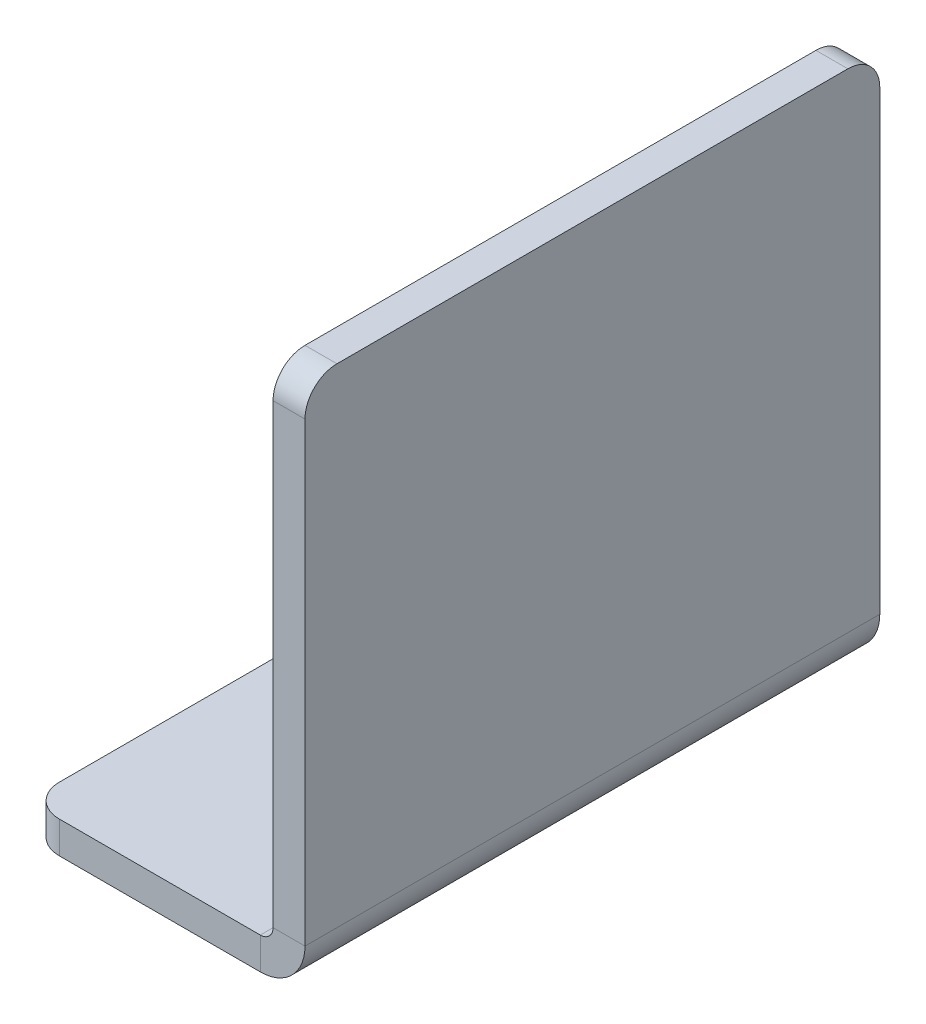
ISO-10303-21;
HEADER;
FILE_DESCRIPTION(('STEP AP214'),'2;1');
FILE_NAME('part.step','',(''),(''),'','','');
FILE_SCHEMA(('AUTOMOTIVE_DESIGN { 1 0 10303 214 1 1 1 1 }'));
ENDSEC;
DATA;
#1=APPLICATION_CONTEXT('core data for automotive mechanical design processes');
#2=APPLICATION_PROTOCOL_DEFINITION('international standard','automotive_design',2000,#1);
#3=PRODUCT_CONTEXT('',#1,'mechanical');
#4=PRODUCT('Part','Part','',(#3));
#5=PRODUCT_RELATED_PRODUCT_CATEGORY('part','',(#4));
#6=PRODUCT_DEFINITION_FORMATION('','',#4);
#7=PRODUCT_DEFINITION_CONTEXT('part definition',#1,'design');
#8=PRODUCT_DEFINITION('design','',#6,#7);
#9=PRODUCT_DEFINITION_SHAPE('','',#8);
#10=(LENGTH_UNIT() NAMED_UNIT(*) SI_UNIT(.MILLI.,.METRE.));
#11=(NAMED_UNIT(*) PLANE_ANGLE_UNIT() SI_UNIT($,.RADIAN.));
#12=(NAMED_UNIT(*) SI_UNIT($,.STERADIAN.) SOLID_ANGLE_UNIT());
#13=UNCERTAINTY_MEASURE_WITH_UNIT(LENGTH_MEASURE(1.E-05),#10,'distance_accuracy_value','');
#14=(GEOMETRIC_REPRESENTATION_CONTEXT(3) GLOBAL_UNCERTAINTY_ASSIGNED_CONTEXT((#13)) GLOBAL_UNIT_ASSIGNED_CONTEXT((#10,
#11,#12)) REPRESENTATION_CONTEXT('',''));
#15=CARTESIAN_POINT('',(0.,0.,0.));
#16=DIRECTION('',(0.,0.,1.));
#17=DIRECTION('',(1.,0.,0.));
#18=AXIS2_PLACEMENT_3D('',#15,#16,#17);
#19=CARTESIAN_POINT('',(48.8514494961838,-46.3985505038164,0.));
#20=DIRECTION('',(1.,0.,0.));
#21=DIRECTION('',(0.,0.,-1.));
#22=AXIS2_PLACEMENT_3D('',#19,#20,#21);
#23=PLANE('',#22);
#24=DIRECTION('',(0.,0.,-1.));
#25=VECTOR('',#24,1.);
#26=CARTESIAN_POINT('',(48.8514494961832,106.001449496184,0.));
#27=LINE('',#26,#25);
#28=CARTESIAN_POINT('',(48.8514494961832,106.001449496184,-6.34999999999999));
#29=VERTEX_POINT('',#28);
#30=CARTESIAN_POINT('',(48.8514494961832,106.001449496184,-107.95));
#31=VERTEX_POINT('',#30);
#32=EDGE_CURVE('E192',#29,#31,#27,.T.);
#33=ORIENTED_EDGE('',*,*,#32,.T.);
#34=CARTESIAN_POINT('',(48.8514494961832,99.6514494961836,-107.95));
#35=DIRECTION('',(1.,0.,0.));
#36=DIRECTION('',(0.,1.,0.));
#37=AXIS2_PLACEMENT_3D('',#34,#35,#36);
#38=CIRCLE('',#37,6.35);
#39=CARTESIAN_POINT('',(48.8514494961832,99.6514494961835,-114.3));
#40=VERTEX_POINT('',#39);
#41=EDGE_CURVE('E238',#31,#40,#38,.F.);
#42=ORIENTED_EDGE('',*,*,#41,.T.);
#43=DIRECTION('',(0.,-1.,0.));
#44=VECTOR('',#43,1.);
#45=CARTESIAN_POINT('',(48.8514494961838,-46.3985505038164,-114.3));
#46=LINE('',#45,#44);
#47=CARTESIAN_POINT('',(48.8514494961836,8.89000000000001,-114.3));
#48=VERTEX_POINT('',#47);
#49=EDGE_CURVE('E196',#40,#48,#46,.T.);
#50=ORIENTED_EDGE('',*,*,#49,.T.);
#51=DIRECTION('',(0.,0.,1.));
#52=VECTOR('',#51,1.);
#53=CARTESIAN_POINT('',(48.8514494961836,8.89000000000002,0.));
#54=LINE('',#53,#52);
#55=CARTESIAN_POINT('',(48.8514494961836,8.89,0.));
#56=VERTEX_POINT('',#55);
#57=EDGE_CURVE('E167',#48,#56,#54,.T.);
#58=ORIENTED_EDGE('',*,*,#57,.T.);
#59=DIRECTION('',(0.,1.,0.));
#60=VECTOR('',#59,1.);
#61=CARTESIAN_POINT('',(48.8514494961838,-46.3985505038164,0.));
#62=LINE('',#61,#60);
#63=CARTESIAN_POINT('',(48.8514494961833,99.6514494961835,0.));
#64=VERTEX_POINT('',#63);
#65=EDGE_CURVE('E197',#56,#64,#62,.T.);
#66=ORIENTED_EDGE('',*,*,#65,.T.);
#67=CARTESIAN_POINT('',(48.8514494961833,99.6514494961836,-6.35));
#68=DIRECTION('',(1.,0.,0.));
#69=DIRECTION('',(0.,1.,0.));
#70=AXIS2_PLACEMENT_3D('',#67,#68,#69);
#71=CIRCLE('',#70,6.35);
#72=EDGE_CURVE('E235',#64,#29,#71,.F.);
#73=ORIENTED_EDGE('',*,*,#72,.T.);
#74=EDGE_LOOP('',(#33,#42,#50,#58,#66,#73));
#75=FACE_BOUND('',#74,.T.);
#76=ADVANCED_FACE('F51',(#75),#23,.F.);
#77=CARTESIAN_POINT('',(48.8514494961832,106.001449496184,0.));
#78=DIRECTION('',(0.,-1.,0.));
#79=DIRECTION('',(0.,0.,-1.));
#80=AXIS2_PLACEMENT_3D('',#77,#78,#79);
#81=PLANE('',#80);
#82=DIRECTION('',(0.,0.,-1.));
#83=VECTOR('',#82,1.);
#84=CARTESIAN_POINT('',(55.2014494961832,106.001449496184,0.));
#85=LINE('',#84,#83);
#86=CARTESIAN_POINT('',(55.2014494961832,106.001449496184,-6.35));
#87=VERTEX_POINT('',#86);
#88=CARTESIAN_POINT('',(55.2014494961832,106.001449496184,-107.95));
#89=VERTEX_POINT('',#88);
#90=EDGE_CURVE('E198',#87,#89,#85,.T.);
#91=ORIENTED_EDGE('',*,*,#90,.T.);
#92=DIRECTION('',(1.,0.,0.));
#93=VECTOR('',#92,1.);
#94=CARTESIAN_POINT('',(48.8514494961832,106.001449496184,-107.95));
#95=LINE('',#94,#93);
#96=EDGE_CURVE('E231',#89,#31,#95,.F.);
#97=ORIENTED_EDGE('',*,*,#96,.T.);
#98=ORIENTED_EDGE('',*,*,#32,.F.);
#99=DIRECTION('',(1.,0.,0.));
#100=VECTOR('',#99,1.);
#101=CARTESIAN_POINT('',(48.8514494961832,106.001449496184,-6.34999999999999));
#102=LINE('',#101,#100);
#103=EDGE_CURVE('E217',#29,#87,#102,.T.);
#104=ORIENTED_EDGE('',*,*,#103,.T.);
#105=EDGE_LOOP('',(#91,#97,#98,#104));
#106=FACE_BOUND('',#105,.T.);
#107=ADVANCED_FACE('F326',(#106),#81,.F.);
#108=CARTESIAN_POINT('',(48.8514494961838,-46.3985505038164,-114.3));
#109=DIRECTION('',(0.,0.,1.));
#110=DIRECTION('',(0.,-1.,0.));
#111=AXIS2_PLACEMENT_3D('',#108,#109,#110);
#112=PLANE('',#111);
#113=ORIENTED_EDGE('',*,*,#49,.F.);
#114=DIRECTION('',(1.,0.,0.));
#115=VECTOR('',#114,1.);
#116=CARTESIAN_POINT('',(48.8514494961832,99.6514494961836,-114.3));
#117=LINE('',#116,#115);
#118=CARTESIAN_POINT('',(55.2014494961833,99.6514494961836,-114.3));
#119=VERTEX_POINT('',#118);
#120=EDGE_CURVE('E241',#40,#119,#117,.T.);
#121=ORIENTED_EDGE('',*,*,#120,.T.);
#122=DIRECTION('',(0.,1.,0.));
#123=VECTOR('',#122,1.);
#124=CARTESIAN_POINT('',(55.2014494961838,-46.3985505038164,-114.3));
#125=LINE('',#124,#123);
#126=CARTESIAN_POINT('',(55.2014494961836,8.89000000000004,-114.3));
#127=VERTEX_POINT('',#126);
#128=EDGE_CURVE('E202',#119,#127,#125,.F.);
#129=ORIENTED_EDGE('',*,*,#128,.T.);
#130=DIRECTION('',(1.,0.,0.));
#131=VECTOR('',#130,1.);
#132=CARTESIAN_POINT('',(48.8514494961836,8.89000000000002,-114.3));
#133=LINE('',#132,#131);
#134=EDGE_CURVE('E206',#48,#127,#133,.T.);
#135=ORIENTED_EDGE('',*,*,#134,.F.);
#136=EDGE_LOOP('',(#113,#121,#129,#135));
#137=FACE_BOUND('',#136,.T.);
#138=ADVANCED_FACE('F314',(#137),#112,.F.);
#139=CARTESIAN_POINT('',(48.8514494961838,-46.3985505038164,0.));
#140=DIRECTION('',(0.,0.,-1.));
#141=DIRECTION('',(0.,1.,0.));
#142=AXIS2_PLACEMENT_3D('',#139,#140,#141);
#143=PLANE('',#142);
#144=DIRECTION('',(0.,1.,0.));
#145=VECTOR('',#144,1.);
#146=CARTESIAN_POINT('',(55.2014494961838,-46.3985505038164,0.));
#147=LINE('',#146,#145);
#148=CARTESIAN_POINT('',(55.2014494961836,8.89000000000003,0.));
#149=VERTEX_POINT('',#148);
#150=CARTESIAN_POINT('',(55.2014494961833,99.6514494961836,0.));
#151=VERTEX_POINT('',#150);
#152=EDGE_CURVE('E203',#149,#151,#147,.T.);
#153=ORIENTED_EDGE('',*,*,#152,.T.);
#154=DIRECTION('',(1.,0.,0.));
#155=VECTOR('',#154,1.);
#156=CARTESIAN_POINT('',(48.8514494961833,99.6514494961836,0.));
#157=LINE('',#156,#155);
#158=EDGE_CURVE('E250',#151,#64,#157,.F.);
#159=ORIENTED_EDGE('',*,*,#158,.T.);
#160=ORIENTED_EDGE('',*,*,#65,.F.);
#161=DIRECTION('',(-1.,0.,0.));
#162=VECTOR('',#161,1.);
#163=CARTESIAN_POINT('',(48.8514494961836,8.89000000000002,0.));
#164=LINE('',#163,#162);
#165=EDGE_CURVE('E213',#149,#56,#164,.T.);
#166=ORIENTED_EDGE('',*,*,#165,.F.);
#167=EDGE_LOOP('',(#153,#159,#160,#166));
#168=FACE_BOUND('',#167,.T.);
#169=ADVANCED_FACE('F307',(#168),#143,.F.);
#170=CARTESIAN_POINT('',(55.2014494961838,-46.3985505038164,0.));
#171=DIRECTION('',(1.,0.,0.));
#172=DIRECTION('',(0.,0.,-1.));
#173=AXIS2_PLACEMENT_3D('',#170,#171,#172);
#174=PLANE('',#173);
#175=ORIENTED_EDGE('',*,*,#128,.F.);
#176=CARTESIAN_POINT('',(55.2014494961833,99.6514494961836,-107.95));
#177=DIRECTION('',(1.,0.,0.));
#178=DIRECTION('',(0.,1.,0.));
#179=AXIS2_PLACEMENT_3D('',#176,#177,#178);
#180=CIRCLE('',#179,6.35);
#181=EDGE_CURVE('E247',#119,#89,#180,.T.);
#182=ORIENTED_EDGE('',*,*,#181,.T.);
#183=ORIENTED_EDGE('',*,*,#90,.F.);
#184=CARTESIAN_POINT('',(55.2014494961833,99.6514494961836,-6.35));
#185=DIRECTION('',(1.,0.,0.));
#186=DIRECTION('',(0.,1.,0.));
#187=AXIS2_PLACEMENT_3D('',#184,#185,#186);
#188=CIRCLE('',#187,6.35);
#189=EDGE_CURVE('E244',#87,#151,#188,.T.);
#190=ORIENTED_EDGE('',*,*,#189,.T.);
#191=ORIENTED_EDGE('',*,*,#152,.F.);
#192=DIRECTION('',(0.,0.,1.));
#193=VECTOR('',#192,1.);
#194=CARTESIAN_POINT('',(55.2014494961836,8.89000000000004,0.));
#195=LINE('',#194,#193);
#196=EDGE_CURVE('E209',#127,#149,#195,.T.);
#197=ORIENTED_EDGE('',*,*,#196,.F.);
#198=EDGE_LOOP('',(#175,#182,#183,#190,#191,#197));
#199=FACE_BOUND('',#198,.T.);
#200=ADVANCED_FACE('F338',(#199),#174,.T.);
#201=CARTESIAN_POINT('',(0.,6.35,0.));
#202=DIRECTION('',(1.,0.,0.));
#203=DIRECTION('',(0.,0.,1.));
#204=AXIS2_PLACEMENT_3D('',#201,#202,#203);
#205=PLANE('',#204);
#206=DIRECTION('',(0.,0.,-1.));
#207=VECTOR('',#206,1.);
#208=CARTESIAN_POINT('',(0.,0.,0.));
#209=LINE('',#208,#207);
#210=CARTESIAN_POINT('',(0.,0.,-107.95));
#211=VERTEX_POINT('',#210);
#212=CARTESIAN_POINT('',(0.,0.,-6.35));
#213=VERTEX_POINT('',#212);
#214=EDGE_CURVE('E178',#211,#213,#209,.F.);
#215=ORIENTED_EDGE('',*,*,#214,.T.);
#216=DIRECTION('',(0.,-1.,0.));
#217=VECTOR('',#216,1.);
#218=CARTESIAN_POINT('',(0.,6.35,-6.35));
#219=LINE('',#218,#217);
#220=CARTESIAN_POINT('',(0.,6.35,-6.35));
#221=VERTEX_POINT('',#220);
#222=EDGE_CURVE('E257',#213,#221,#219,.F.);
#223=ORIENTED_EDGE('',*,*,#222,.T.);
#224=DIRECTION('',(0.,0.,1.));
#225=VECTOR('',#224,1.);
#226=CARTESIAN_POINT('',(0.,6.35,0.));
#227=LINE('',#226,#225);
#228=CARTESIAN_POINT('',(0.,6.35,-107.95));
#229=VERTEX_POINT('',#228);
#230=EDGE_CURVE('E183',#229,#221,#227,.T.);
#231=ORIENTED_EDGE('',*,*,#230,.F.);
#232=DIRECTION('',(0.,-1.,0.));
#233=VECTOR('',#232,1.);
#234=CARTESIAN_POINT('',(0.,6.35,-107.95));
#235=LINE('',#234,#233);
#236=EDGE_CURVE('E254',#229,#211,#235,.T.);
#237=ORIENTED_EDGE('',*,*,#236,.T.);
#238=EDGE_LOOP('',(#215,#223,#231,#237));
#239=FACE_BOUND('',#238,.T.);
#240=ADVANCED_FACE('F278',(#239),#205,.F.);
#241=CARTESIAN_POINT('',(0.,6.35,0.));
#242=DIRECTION('',(0.,-1.,0.));
#243=DIRECTION('',(0.,0.,-1.));
#244=AXIS2_PLACEMENT_3D('',#241,#242,#243);
#245=PLANE('',#244);
#246=ORIENTED_EDGE('',*,*,#230,.T.);
#247=CARTESIAN_POINT('',(6.35,6.35,-6.35));
#248=DIRECTION('',(0.,-1.,0.));
#249=DIRECTION('',(0.,0.,-1.));
#250=AXIS2_PLACEMENT_3D('',#247,#248,#249);
#251=CIRCLE('',#250,6.35);
#252=CARTESIAN_POINT('',(6.35,6.35,0.));
#253=VERTEX_POINT('',#252);
#254=EDGE_CURVE('E264',#221,#253,#251,.F.);
#255=ORIENTED_EDGE('',*,*,#254,.T.);
#256=DIRECTION('',(1.,0.,0.));
#257=VECTOR('',#256,1.);
#258=CARTESIAN_POINT('',(0.,6.35,0.));
#259=LINE('',#258,#257);
#260=CARTESIAN_POINT('',(46.3114494961836,6.35,0.));
#261=VERTEX_POINT('',#260);
#262=EDGE_CURVE('E157',#253,#261,#259,.T.);
#263=ORIENTED_EDGE('',*,*,#262,.T.);
#264=DIRECTION('',(0.,0.,1.));
#265=VECTOR('',#264,1.);
#266=CARTESIAN_POINT('',(46.3114494961836,6.35,0.));
#267=LINE('',#266,#265);
#268=CARTESIAN_POINT('',(46.3114494961836,6.35,-114.3));
#269=VERTEX_POINT('',#268);
#270=EDGE_CURVE('E164',#269,#261,#267,.T.);
#271=ORIENTED_EDGE('',*,*,#270,.F.);
#272=DIRECTION('',(-1.,0.,0.));
#273=VECTOR('',#272,1.);
#274=CARTESIAN_POINT('',(0.,6.35,-114.3));
#275=LINE('',#274,#273);
#276=CARTESIAN_POINT('',(6.35,6.35,-114.3));
#277=VERTEX_POINT('',#276);
#278=EDGE_CURVE('E176',#269,#277,#275,.T.);
#279=ORIENTED_EDGE('',*,*,#278,.T.);
#280=CARTESIAN_POINT('',(6.35,6.35,-107.95));
#281=DIRECTION('',(0.,-1.,0.));
#282=DIRECTION('',(0.,0.,-1.));
#283=AXIS2_PLACEMENT_3D('',#280,#281,#282);
#284=CIRCLE('',#283,6.35);
#285=EDGE_CURVE('E261',#277,#229,#284,.F.);
#286=ORIENTED_EDGE('',*,*,#285,.T.);
#287=EDGE_LOOP('',(#246,#255,#263,#271,#279,#286));
#288=FACE_BOUND('',#287,.T.);
#289=ADVANCED_FACE('F175',(#288),#245,.F.);
#290=CARTESIAN_POINT('',(0.,6.35,-114.3));
#291=DIRECTION('',(0.,0.,1.));
#292=DIRECTION('',(-1.,0.,0.));
#293=AXIS2_PLACEMENT_3D('',#290,#291,#292);
#294=PLANE('',#293);
#295=DIRECTION('',(1.,0.,0.));
#296=VECTOR('',#295,1.);
#297=CARTESIAN_POINT('',(0.,0.,-114.3));
#298=LINE('',#297,#296);
#299=CARTESIAN_POINT('',(46.3114494961836,0.,-114.3));
#300=VERTEX_POINT('',#299);
#301=CARTESIAN_POINT('',(6.35,0.,-114.3));
#302=VERTEX_POINT('',#301);
#303=EDGE_CURVE('E156',#300,#302,#298,.F.);
#304=ORIENTED_EDGE('',*,*,#303,.T.);
#305=DIRECTION('',(0.,-1.,0.));
#306=VECTOR('',#305,1.);
#307=CARTESIAN_POINT('',(6.35,6.35,-114.3));
#308=LINE('',#307,#306);
#309=EDGE_CURVE('E12',#302,#277,#308,.F.);
#310=ORIENTED_EDGE('',*,*,#309,.T.);
#311=ORIENTED_EDGE('',*,*,#278,.F.);
#312=DIRECTION('',(0.,-1.,0.));
#313=VECTOR('',#312,1.);
#314=CARTESIAN_POINT('',(46.3114494961836,6.35,-114.3));
#315=LINE('',#314,#313);
#316=EDGE_CURVE('E144',#269,#300,#315,.T.);
#317=ORIENTED_EDGE('',*,*,#316,.T.);
#318=EDGE_LOOP('',(#304,#310,#311,#317));
#319=FACE_BOUND('',#318,.T.);
#320=ADVANCED_FACE('F180',(#319),#294,.F.);
#321=CARTESIAN_POINT('',(0.,0.,0.));
#322=DIRECTION('',(0.,-1.,0.));
#323=DIRECTION('',(0.,0.,-1.));
#324=AXIS2_PLACEMENT_3D('',#321,#322,#323);
#325=PLANE('',#324);
#326=DIRECTION('',(1.,0.,0.));
#327=VECTOR('',#326,1.);
#328=CARTESIAN_POINT('',(0.,0.,0.));
#329=LINE('',#328,#327);
#330=CARTESIAN_POINT('',(6.35,0.,0.));
#331=VERTEX_POINT('',#330);
#332=CARTESIAN_POINT('',(46.3114494961836,0.,0.));
#333=VERTEX_POINT('',#332);
#334=EDGE_CURVE('E274',#331,#333,#329,.T.);
#335=ORIENTED_EDGE('',*,*,#334,.F.);
#336=CARTESIAN_POINT('',(6.35,0.,-6.35));
#337=DIRECTION('',(0.,-1.,0.));
#338=DIRECTION('',(0.,0.,-1.));
#339=AXIS2_PLACEMENT_3D('',#336,#337,#338);
#340=CIRCLE('',#339,6.35);
#341=EDGE_CURVE('E60',#331,#213,#340,.T.);
#342=ORIENTED_EDGE('',*,*,#341,.T.);
#343=ORIENTED_EDGE('',*,*,#214,.F.);
#344=CARTESIAN_POINT('',(6.35,0.,-107.95));
#345=DIRECTION('',(0.,-1.,0.));
#346=DIRECTION('',(0.,0.,-1.));
#347=AXIS2_PLACEMENT_3D('',#344,#345,#346);
#348=CIRCLE('',#347,6.35);
#349=EDGE_CURVE('E67',#211,#302,#348,.T.);
#350=ORIENTED_EDGE('',*,*,#349,.T.);
#351=ORIENTED_EDGE('',*,*,#303,.F.);
#352=DIRECTION('',(0.,0.,1.));
#353=VECTOR('',#352,1.);
#354=CARTESIAN_POINT('',(46.3114494961836,0.,0.));
#355=LINE('',#354,#353);
#356=EDGE_CURVE('E289',#300,#333,#355,.T.);
#357=ORIENTED_EDGE('',*,*,#356,.T.);
#358=EDGE_LOOP('',(#335,#342,#343,#350,#351,#357));
#359=FACE_BOUND('',#358,.T.);
#360=ADVANCED_FACE('F272',(#359),#325,.T.);
#361=CARTESIAN_POINT('',(0.,6.35,0.));
#362=DIRECTION('',(0.,0.,-1.));
#363=DIRECTION('',(1.,0.,0.));
#364=AXIS2_PLACEMENT_3D('',#361,#362,#363);
#365=PLANE('',#364);
#366=ORIENTED_EDGE('',*,*,#262,.F.);
#367=DIRECTION('',(0.,-1.,0.));
#368=VECTOR('',#367,1.);
#369=CARTESIAN_POINT('',(6.35,6.35,0.));
#370=LINE('',#369,#368);
#371=EDGE_CURVE('E75',#253,#331,#370,.T.);
#372=ORIENTED_EDGE('',*,*,#371,.T.);
#373=ORIENTED_EDGE('',*,*,#334,.T.);
#374=DIRECTION('',(0.,1.,0.));
#375=VECTOR('',#374,1.);
#376=CARTESIAN_POINT('',(46.3114494961836,6.35,0.));
#377=LINE('',#376,#375);
#378=EDGE_CURVE('E221',#333,#261,#377,.T.);
#379=ORIENTED_EDGE('',*,*,#378,.T.);
#380=EDGE_LOOP('',(#366,#372,#373,#379));
#381=FACE_BOUND('',#380,.T.);
#382=ADVANCED_FACE('F283',(#381),#365,.F.);
#383=CARTESIAN_POINT('',(46.3114494961836,8.89,-114.3));
#384=DIRECTION('',(0.,0.,1.));
#385=DIRECTION('',(1.,0.,0.));
#386=AXIS2_PLACEMENT_3D('',#383,#384,#385);
#387=PLANE('',#386);
#388=ORIENTED_EDGE('',*,*,#134,.T.);
#389=CARTESIAN_POINT('',(46.3114494961836,8.89,-114.3));
#390=DIRECTION('',(0.,0.,-1.));
#391=DIRECTION('',(-1.,0.,0.));
#392=AXIS2_PLACEMENT_3D('',#389,#390,#391);
#393=CIRCLE('',#392,8.89);
#394=EDGE_CURVE('E151',#127,#300,#393,.T.);
#395=ORIENTED_EDGE('',*,*,#394,.T.);
#396=ORIENTED_EDGE('',*,*,#316,.F.);
#397=CARTESIAN_POINT('',(46.3114494961836,8.89,-114.3));
#398=DIRECTION('',(0.,0.,-1.));
#399=DIRECTION('',(-1.,0.,0.));
#400=AXIS2_PLACEMENT_3D('',#397,#398,#399);
#401=CIRCLE('',#400,2.54);
#402=EDGE_CURVE('E148',#48,#269,#401,.T.);
#403=ORIENTED_EDGE('',*,*,#402,.F.);
#404=EDGE_LOOP('',(#388,#395,#396,#403));
#405=FACE_BOUND('',#404,.T.);
#406=ADVANCED_FACE('F147',(#405),#387,.F.);
#407=CARTESIAN_POINT('',(46.3114494961836,8.89,0.));
#408=DIRECTION('',(0.,0.,-1.));
#409=DIRECTION('',(-1.,0.,0.));
#410=AXIS2_PLACEMENT_3D('',#407,#408,#409);
#411=PLANE('',#410);
#412=ORIENTED_EDGE('',*,*,#378,.F.);
#413=CARTESIAN_POINT('',(46.3114494961836,8.89,0.));
#414=DIRECTION('',(0.,0.,-1.));
#415=DIRECTION('',(-1.,0.,0.));
#416=AXIS2_PLACEMENT_3D('',#413,#414,#415);
#417=CIRCLE('',#416,8.89);
#418=EDGE_CURVE('E170',#333,#149,#417,.F.);
#419=ORIENTED_EDGE('',*,*,#418,.T.);
#420=ORIENTED_EDGE('',*,*,#165,.T.);
#421=CARTESIAN_POINT('',(46.3114494961836,8.89,0.));
#422=DIRECTION('',(0.,0.,1.));
#423=DIRECTION('',(1.,0.,0.));
#424=AXIS2_PLACEMENT_3D('',#421,#422,#423);
#425=CIRCLE('',#424,2.54);
#426=EDGE_CURVE('E169',#261,#56,#425,.T.);
#427=ORIENTED_EDGE('',*,*,#426,.F.);
#428=EDGE_LOOP('',(#412,#419,#420,#427));
#429=FACE_BOUND('',#428,.T.);
#430=ADVANCED_FACE('F303',(#429),#411,.F.);
#431=CARTESIAN_POINT('',(46.3114494961836,8.89,57.6777006758441));
#432=DIRECTION('',(0.,0.,-1.));
#433=DIRECTION('',(-1.,0.,0.));
#434=AXIS2_PLACEMENT_3D('',#431,#432,#433);
#435=CYLINDRICAL_SURFACE('',#434,2.54);
#436=ORIENTED_EDGE('',*,*,#426,.T.);
#437=ORIENTED_EDGE('',*,*,#57,.F.);
#438=ORIENTED_EDGE('',*,*,#402,.T.);
#439=ORIENTED_EDGE('',*,*,#270,.T.);
#440=EDGE_LOOP('',(#436,#437,#438,#439));
#441=FACE_BOUND('',#440,.T.);
#442=ADVANCED_FACE('F163',(#441),#435,.F.);
#443=CARTESIAN_POINT('',(46.3114494961836,8.89,57.6777006758441));
#444=DIRECTION('',(0.,0.,-1.));
#445=DIRECTION('',(-1.,0.,0.));
#446=AXIS2_PLACEMENT_3D('',#443,#444,#445);
#447=CYLINDRICAL_SURFACE('',#446,8.89);
#448=ORIENTED_EDGE('',*,*,#418,.F.);
#449=ORIENTED_EDGE('',*,*,#356,.F.);
#450=ORIENTED_EDGE('',*,*,#394,.F.);
#451=ORIENTED_EDGE('',*,*,#196,.T.);
#452=EDGE_LOOP('',(#448,#449,#450,#451));
#453=FACE_BOUND('',#452,.T.);
#454=ADVANCED_FACE('F318',(#453),#447,.T.);
#455=CARTESIAN_POINT('',(48.8514494961832,99.6514494961836,-107.95));
#456=DIRECTION('',(-1.,0.,0.));
#457=DIRECTION('',(0.,-1.,0.));
#458=AXIS2_PLACEMENT_3D('',#455,#456,#457);
#459=CYLINDRICAL_SURFACE('',#458,6.35);
#460=ORIENTED_EDGE('',*,*,#181,.F.);
#461=ORIENTED_EDGE('',*,*,#120,.F.);
#462=ORIENTED_EDGE('',*,*,#41,.F.);
#463=ORIENTED_EDGE('',*,*,#96,.F.);
#464=EDGE_LOOP('',(#460,#461,#462,#463));
#465=FACE_BOUND('',#464,.T.);
#466=ADVANCED_FACE('F344',(#465),#459,.T.);
#467=CARTESIAN_POINT('',(48.8514494961833,99.6514494961836,-6.35));
#468=DIRECTION('',(-1.,0.,0.));
#469=DIRECTION('',(0.,-1.,0.));
#470=AXIS2_PLACEMENT_3D('',#467,#468,#469);
#471=CYLINDRICAL_SURFACE('',#470,6.35);
#472=ORIENTED_EDGE('',*,*,#189,.F.);
#473=ORIENTED_EDGE('',*,*,#103,.F.);
#474=ORIENTED_EDGE('',*,*,#72,.F.);
#475=ORIENTED_EDGE('',*,*,#158,.F.);
#476=EDGE_LOOP('',(#472,#473,#474,#475));
#477=FACE_BOUND('',#476,.T.);
#478=ADVANCED_FACE('F324',(#477),#471,.T.);
#479=CARTESIAN_POINT('',(6.35,6.35,-6.35));
#480=DIRECTION('',(0.,1.,0.));
#481=DIRECTION('',(0.,0.,1.));
#482=AXIS2_PLACEMENT_3D('',#479,#480,#481);
#483=CYLINDRICAL_SURFACE('',#482,6.35);
#484=ORIENTED_EDGE('',*,*,#341,.F.);
#485=ORIENTED_EDGE('',*,*,#371,.F.);
#486=ORIENTED_EDGE('',*,*,#254,.F.);
#487=ORIENTED_EDGE('',*,*,#222,.F.);
#488=EDGE_LOOP('',(#484,#485,#486,#487));
#489=FACE_BOUND('',#488,.T.);
#490=ADVANCED_FACE('F281',(#489),#483,.T.);
#491=CARTESIAN_POINT('',(6.35,6.35,-107.95));
#492=DIRECTION('',(0.,1.,0.));
#493=DIRECTION('',(0.,0.,1.));
#494=AXIS2_PLACEMENT_3D('',#491,#492,#493);
#495=CYLINDRICAL_SURFACE('',#494,6.35);
#496=ORIENTED_EDGE('',*,*,#349,.F.);
#497=ORIENTED_EDGE('',*,*,#236,.F.);
#498=ORIENTED_EDGE('',*,*,#285,.F.);
#499=ORIENTED_EDGE('',*,*,#309,.F.);
#500=EDGE_LOOP('',(#496,#497,#498,#499));
#501=FACE_BOUND('',#500,.T.);
#502=ADVANCED_FACE('F53',(#501),#495,.T.);
#503=CLOSED_SHELL('',(#76,#107,#138,#169,#200,#240,#289,#320,#360,#382,#406,#430,#442,#454,#466,
#478,#490,#502));
#504=MANIFOLD_SOLID_BREP('B2',#503);
#505=ADVANCED_BREP_SHAPE_REPRESENTATION('',(#18,#504),#14);
#506=SHAPE_DEFINITION_REPRESENTATION(#9,#505);
ENDSEC;
END-ISO-10303-21;
